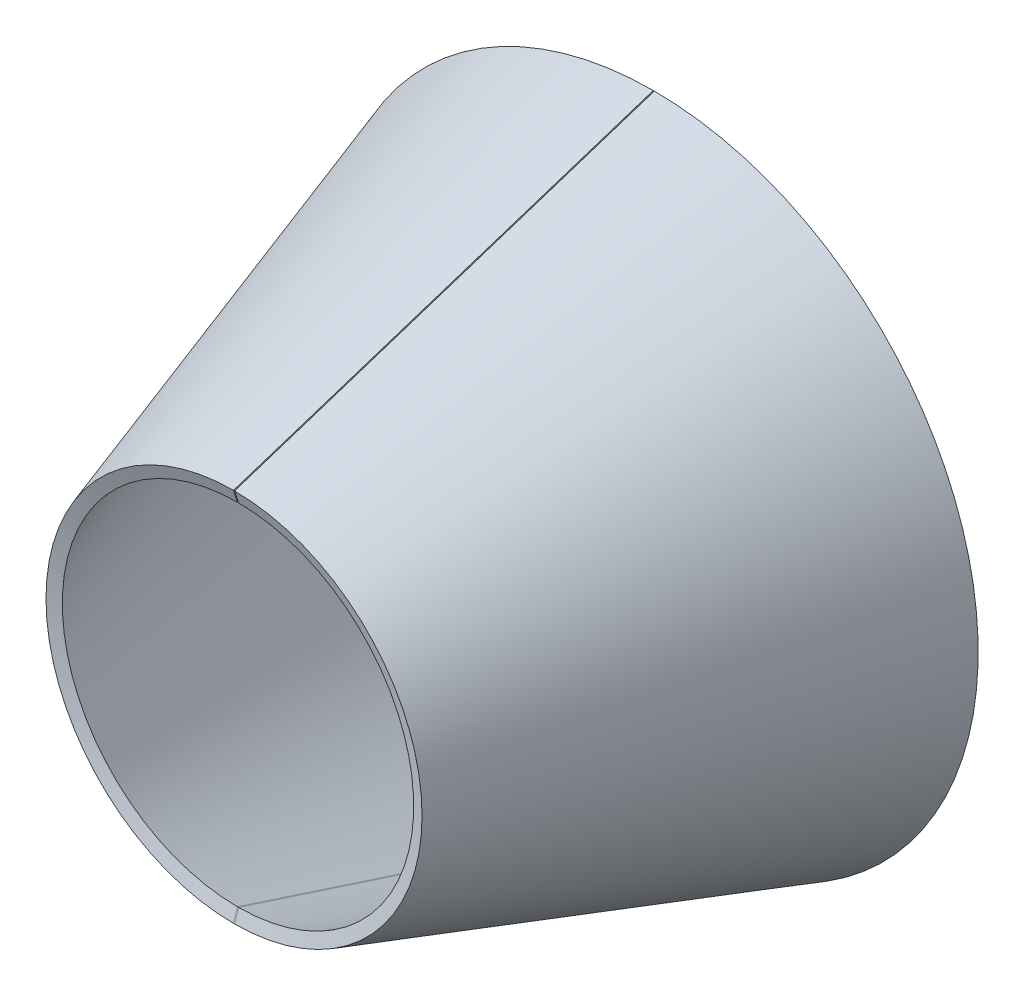
ISO-10303-21;
HEADER;
FILE_DESCRIPTION(('STEP AP214'),'2;1');
FILE_NAME('part.step','',(''),(''),'','','');
FILE_SCHEMA(('AUTOMOTIVE_DESIGN { 1 0 10303 214 1 1 1 1 }'));
ENDSEC;
DATA;
#1=APPLICATION_CONTEXT('core data for automotive mechanical design processes');
#2=APPLICATION_PROTOCOL_DEFINITION('international standard','automotive_design',2000,#1);
#3=PRODUCT_CONTEXT('',#1,'mechanical');
#4=PRODUCT('Part','Part','',(#3));
#5=PRODUCT_RELATED_PRODUCT_CATEGORY('part','',(#4));
#6=PRODUCT_DEFINITION_FORMATION('','',#4);
#7=PRODUCT_DEFINITION_CONTEXT('part definition',#1,'design');
#8=PRODUCT_DEFINITION('design','',#6,#7);
#9=PRODUCT_DEFINITION_SHAPE('','',#8);
#10=(LENGTH_UNIT() NAMED_UNIT(*) SI_UNIT(.MILLI.,.METRE.));
#11=(NAMED_UNIT(*) PLANE_ANGLE_UNIT() SI_UNIT($,.RADIAN.));
#12=(NAMED_UNIT(*) SI_UNIT($,.STERADIAN.) SOLID_ANGLE_UNIT());
#13=UNCERTAINTY_MEASURE_WITH_UNIT(LENGTH_MEASURE(1.E-05),#10,'distance_accuracy_value','');
#14=(GEOMETRIC_REPRESENTATION_CONTEXT(3) GLOBAL_UNCERTAINTY_ASSIGNED_CONTEXT((#13)) GLOBAL_UNIT_ASSIGNED_CONTEXT((#10,
#11,#12)) REPRESENTATION_CONTEXT('',''));
#15=CARTESIAN_POINT('',(0.,0.,0.));
#16=DIRECTION('',(0.,0.,1.));
#17=DIRECTION('',(1.,0.,0.));
#18=AXIS2_PLACEMENT_3D('',#15,#16,#17);
#19=CARTESIAN_POINT('',(0.254,-91.7224397929244,207.295359782405));
#20=DIRECTION('',(0.,0.951056516295156,-0.309016994374941));
#21=DIRECTION('',(0.,0.309016994374941,0.951056516295156));
#22=AXIS2_PLACEMENT_3D('',#19,#20,#21);
#23=PLANE('',#22);
#24=DIRECTION('',(0.,-0.309016994374941,-0.951056516295156));
#25=VECTOR('',#24,1.);
#26=CARTESIAN_POINT('',(-0.254,-91.7224397929244,207.295359782405));
#27=LINE('',#26,#25);
#28=CARTESIAN_POINT('',(-0.253999999999983,-91.7224397929245,207.295359782405));
#29=VERTEX_POINT('',#28);
#30=CARTESIAN_POINT('',(-0.254,-158.439208878474,1.96225791428088));
#31=VERTEX_POINT('',#30);
#32=EDGE_CURVE('E160',#29,#31,#27,.T.);
#33=ORIENTED_EDGE('',*,*,#32,.T.);
#34=DIRECTION('',(-1.,0.,0.));
#35=VECTOR('',#34,1.);
#36=CARTESIAN_POINT('',(0.254,-158.439208878474,1.96225791428076));
#37=LINE('',#36,#35);
#38=CARTESIAN_POINT('',(0.253999999999971,-158.439208878474,1.96225791428084));
#39=VERTEX_POINT('',#38);
#40=EDGE_CURVE('E163',#39,#31,#37,.T.);
#41=ORIENTED_EDGE('',*,*,#40,.F.);
#42=DIRECTION('',(0.,-0.309016994374941,-0.951056516295156));
#43=VECTOR('',#42,1.);
#44=CARTESIAN_POINT('',(0.254,-91.7224397929244,207.295359782405));
#45=LINE('',#44,#43);
#46=CARTESIAN_POINT('',(0.254,-91.7224397929244,207.295359782405));
#47=VERTEX_POINT('',#46);
#48=EDGE_CURVE('E62',#47,#39,#45,.T.);
#49=ORIENTED_EDGE('',*,*,#48,.F.);
#50=DIRECTION('',(-1.,0.,0.));
#51=VECTOR('',#50,1.);
#52=CARTESIAN_POINT('',(0.254,-91.7224397929244,207.295359782405));
#53=LINE('',#52,#51);
#54=EDGE_CURVE('E166',#47,#29,#53,.T.);
#55=ORIENTED_EDGE('',*,*,#54,.T.);
#56=EDGE_LOOP('',(#33,#41,#49,#55));
#57=FACE_BOUND('',#56,.T.);
#58=ADVANCED_FACE('F38',(#57),#23,.F.);
#59=CARTESIAN_POINT('',(0.254,324.984109612484,71.89919433134));
#60=DIRECTION('',(0.,0.309016994374941,0.951056516295156));
#61=DIRECTION('',(0.,-0.951056516295156,0.309016994374941));
#62=AXIS2_PLACEMENT_3D('',#59,#60,#61);
#63=PLANE('',#62);
#64=ORIENTED_EDGE('',*,*,#54,.F.);
#65=DIRECTION('',(0.,-0.951056516295156,0.309016994374941));
#66=VECTOR('',#65,1.);
#67=CARTESIAN_POINT('',(0.254,324.984109612484,71.89919433134));
#68=LINE('',#67,#66);
#69=CARTESIAN_POINT('',(0.254,-85.6832309144502,205.333101868124));
#70=VERTEX_POINT('',#69);
#71=EDGE_CURVE('E46',#70,#47,#68,.T.);
#72=ORIENTED_EDGE('',*,*,#71,.F.);
#73=DIRECTION('',(-1.,0.,0.));
#74=VECTOR('',#73,1.);
#75=CARTESIAN_POINT('',(0.254,-85.6832309144502,205.333101868124));
#76=LINE('',#75,#74);
#77=CARTESIAN_POINT('',(-0.253999999999984,-85.68323091445,205.333101868124));
#78=VERTEX_POINT('',#77);
#79=EDGE_CURVE('E171',#70,#78,#76,.T.);
#80=ORIENTED_EDGE('',*,*,#79,.T.);
#81=DIRECTION('',(0.,-0.951056516295156,0.309016994374941));
#82=VECTOR('',#81,1.);
#83=CARTESIAN_POINT('',(-0.254,324.984109612484,71.89919433134));
#84=LINE('',#83,#82);
#85=EDGE_CURVE('E11',#78,#29,#84,.T.);
#86=ORIENTED_EDGE('',*,*,#85,.T.);
#87=EDGE_LOOP('',(#64,#72,#80,#86));
#88=FACE_BOUND('',#87,.T.);
#89=ADVANCED_FACE('F40',(#88),#63,.T.);
#90=CARTESIAN_POINT('',(0.254,258.267340526934,-133.433907536784));
#91=DIRECTION('',(0.,0.309016994374941,0.951056516295156));
#92=DIRECTION('',(0.,-0.951056516295156,0.309016994374941));
#93=AXIS2_PLACEMENT_3D('',#90,#91,#92);
#94=PLANE('',#93);
#95=DIRECTION('',(0.,-0.951056516295156,0.309016994374941));
#96=VECTOR('',#95,1.);
#97=CARTESIAN_POINT('',(0.254,258.267340526934,-133.433907536784));
#98=LINE('',#97,#96);
#99=CARTESIAN_POINT('',(0.254,-152.4,0.));
#100=VERTEX_POINT('',#99);
#101=EDGE_CURVE('E178',#100,#39,#98,.T.);
#102=ORIENTED_EDGE('',*,*,#101,.T.);
#103=ORIENTED_EDGE('',*,*,#40,.T.);
#104=DIRECTION('',(0.,-0.951056516295156,0.309016994374941));
#105=VECTOR('',#104,1.);
#106=CARTESIAN_POINT('',(-0.254,258.267340526934,-133.433907536784));
#107=LINE('',#106,#105);
#108=CARTESIAN_POINT('',(-0.254000000000028,-152.4,0.));
#109=VERTEX_POINT('',#108);
#110=EDGE_CURVE('E126',#109,#31,#107,.T.);
#111=ORIENTED_EDGE('',*,*,#110,.F.);
#112=DIRECTION('',(-1.,0.,0.));
#113=VECTOR('',#112,1.);
#114=CARTESIAN_POINT('',(0.254,-152.4,0.));
#115=LINE('',#114,#113);
#116=EDGE_CURVE('E53',#100,#109,#115,.T.);
#117=ORIENTED_EDGE('',*,*,#116,.F.);
#118=EDGE_LOOP('',(#102,#103,#111,#117));
#119=FACE_BOUND('',#118,.T.);
#120=ADVANCED_FACE('F203',(#119),#94,.F.);
#121=CARTESIAN_POINT('',(0.254,-85.6832309144502,205.333101868124));
#122=DIRECTION('',(0.,0.951056516295156,-0.309016994374941));
#123=DIRECTION('',(0.,0.309016994374941,0.951056516295156));
#124=AXIS2_PLACEMENT_3D('',#121,#122,#123);
#125=PLANE('',#124);
#126=DIRECTION('',(0.,-0.309016994374941,-0.951056516295156));
#127=VECTOR('',#126,1.);
#128=CARTESIAN_POINT('',(-0.254,-85.6832309144502,205.333101868124));
#129=LINE('',#128,#127);
#130=EDGE_CURVE('E168',#78,#109,#129,.T.);
#131=ORIENTED_EDGE('',*,*,#130,.F.);
#132=ORIENTED_EDGE('',*,*,#79,.F.);
#133=DIRECTION('',(0.,-0.309016994374941,-0.951056516295156));
#134=VECTOR('',#133,1.);
#135=CARTESIAN_POINT('',(0.254,-85.6832309144502,205.333101868124));
#136=LINE('',#135,#134);
#137=EDGE_CURVE('E174',#70,#100,#136,.T.);
#138=ORIENTED_EDGE('',*,*,#137,.T.);
#139=ORIENTED_EDGE('',*,*,#116,.T.);
#140=EDGE_LOOP('',(#131,#132,#138,#139));
#141=FACE_BOUND('',#140,.T.);
#142=ADVANCED_FACE('F200',(#141),#125,.T.);
#143=CARTESIAN_POINT('',(0.253999999996857,155.419604439237,0.981128957140143));
#144=DIRECTION('',(-1.,0.,0.));
#145=DIRECTION('',(0.,-0.309016994374942,0.951056516295156));
#146=AXIS2_PLACEMENT_3D('',#143,#144,#145);
#147=PLANE('',#146);
#148=DIRECTION('',(0.,-0.951056516295156,-0.309016994374941));
#149=VECTOR('',#148,1.);
#150=CARTESIAN_POINT('',(0.253999999998202,88.7028353536873,206.314230825265));
#151=LINE('',#150,#149);
#152=CARTESIAN_POINT('',(0.253999999998141,91.7224397929245,207.295359782405));
#153=VERTEX_POINT('',#152);
#154=CARTESIAN_POINT('',(0.253999999998263,85.68323091445,205.333101868124));
#155=VERTEX_POINT('',#154);
#156=EDGE_CURVE('E158',#153,#155,#151,.T.);
#157=ORIENTED_EDGE('',*,*,#156,.F.);
#158=DIRECTION('',(0.,0.309016994374941,-0.951056516295156));
#159=VECTOR('',#158,1.);
#160=CARTESIAN_POINT('',(0.253999999978811,1045.46756241535,-2728.03030277388));
#161=LINE('',#160,#159);
#162=CARTESIAN_POINT('',(0.253999999996796,158.439208878474,1.96225791428056));
#163=VERTEX_POINT('',#162);
#164=EDGE_CURVE('E152',#163,#153,#161,.F.);
#165=ORIENTED_EDGE('',*,*,#164,.F.);
#166=DIRECTION('',(0.,-0.951056516295155,-0.309016994374941));
#167=VECTOR('',#166,1.);
#168=CARTESIAN_POINT('',(0.253999999996857,155.419604439237,0.981128957140143));
#169=LINE('',#168,#167);
#170=CARTESIAN_POINT('',(0.253999999996918,152.4,-3.76434994286967E-13));
#171=VERTEX_POINT('',#170);
#172=EDGE_CURVE('E142',#163,#171,#169,.T.);
#173=ORIENTED_EDGE('',*,*,#172,.T.);
#174=DIRECTION('',(0.,0.309016994374941,-0.951056516295156));
#175=VECTOR('',#174,1.);
#176=CARTESIAN_POINT('',(0.253999999978934,1039.42835353687,-2729.99256068816));
#177=LINE('',#176,#175);
#178=EDGE_CURVE('E143',#171,#155,#177,.F.);
#179=ORIENTED_EDGE('',*,*,#178,.T.);
#180=EDGE_LOOP('',(#157,#165,#173,#179));
#181=FACE_BOUND('',#180,.T.);
#182=ADVANCED_FACE('F192',(#181),#147,.T.);
#183=CARTESIAN_POINT('',(0.254,0.,0.98112895714042));
#184=DIRECTION('',(0.,0.,1.));
#185=DIRECTION('',(1.,0.,0.));
#186=AXIS2_PLACEMENT_3D('',#183,#184,#185);
#187=CONICAL_SURFACE('',#186,155.419604439237,1.25663706143592);
#188=ORIENTED_EDGE('',*,*,#172,.F.);
#189=CARTESIAN_POINT('',(0.254,0.,1.96225791428084));
#190=DIRECTION('',(0.,0.,-1.));
#191=DIRECTION('',(-1.,0.,0.));
#192=AXIS2_PLACEMENT_3D('',#189,#190,#191);
#193=CIRCLE('',#192,158.439208878474);
#194=EDGE_CURVE('E149',#39,#163,#193,.F.);
#195=ORIENTED_EDGE('',*,*,#194,.F.);
#196=ORIENTED_EDGE('',*,*,#101,.F.);
#197=CARTESIAN_POINT('',(0.254,0.,0.));
#198=DIRECTION('',(0.,0.,-1.));
#199=DIRECTION('',(-1.,0.,0.));
#200=AXIS2_PLACEMENT_3D('',#197,#198,#199);
#201=CIRCLE('',#200,152.4);
#202=EDGE_CURVE('E139',#100,#171,#201,.F.);
#203=ORIENTED_EDGE('',*,*,#202,.T.);
#204=EDGE_LOOP('',(#188,#195,#196,#203));
#205=FACE_BOUND('',#204,.T.);
#206=ADVANCED_FACE('F202',(#205),#187,.T.);
#207=CARTESIAN_POINT('',(0.254,0.,206.314230825265));
#208=DIRECTION('',(0.,0.,1.));
#209=DIRECTION('',(1.,0.,0.));
#210=AXIS2_PLACEMENT_3D('',#207,#208,#209);
#211=CONICAL_SURFACE('',#210,88.7028353536873,1.25663706143592);
#212=CARTESIAN_POINT('',(0.254,0.,207.295359782405));
#213=DIRECTION('',(0.,0.,-1.));
#214=DIRECTION('',(-1.,0.,0.));
#215=AXIS2_PLACEMENT_3D('',#212,#213,#214);
#216=CIRCLE('',#215,91.7224397929244);
#217=EDGE_CURVE('E138',#153,#47,#216,.T.);
#218=ORIENTED_EDGE('',*,*,#217,.F.);
#219=ORIENTED_EDGE('',*,*,#156,.T.);
#220=CARTESIAN_POINT('',(0.254,0.,205.333101868124));
#221=DIRECTION('',(0.,0.,-1.));
#222=DIRECTION('',(-1.,0.,0.));
#223=AXIS2_PLACEMENT_3D('',#220,#221,#222);
#224=CIRCLE('',#223,85.68323091445);
#225=EDGE_CURVE('E146',#155,#70,#224,.T.);
#226=ORIENTED_EDGE('',*,*,#225,.T.);
#227=ORIENTED_EDGE('',*,*,#71,.T.);
#228=EDGE_LOOP('',(#218,#219,#226,#227));
#229=FACE_BOUND('',#228,.T.);
#230=ADVANCED_FACE('F182',(#229),#211,.F.);
#231=CARTESIAN_POINT('',(0.254,0.,-2729.99256068816));
#232=DIRECTION('',(0.,0.,-1.));
#233=DIRECTION('',(-1.,0.,0.));
#234=AXIS2_PLACEMENT_3D('',#231,#232,#233);
#235=CONICAL_SURFACE('',#234,1039.42835353687,0.314159265358973);
#236=ORIENTED_EDGE('',*,*,#137,.F.);
#237=ORIENTED_EDGE('',*,*,#225,.F.);
#238=ORIENTED_EDGE('',*,*,#178,.F.);
#239=ORIENTED_EDGE('',*,*,#202,.F.);
#240=EDGE_LOOP('',(#236,#237,#238,#239));
#241=FACE_BOUND('',#240,.T.);
#242=ADVANCED_FACE('F195',(#241),#235,.F.);
#243=CARTESIAN_POINT('',(0.254,0.,-2728.03030277388));
#244=DIRECTION('',(0.,0.,-1.));
#245=DIRECTION('',(-1.,0.,0.));
#246=AXIS2_PLACEMENT_3D('',#243,#244,#245);
#247=CONICAL_SURFACE('',#246,1045.46756241535,0.314159265358973);
#248=ORIENTED_EDGE('',*,*,#48,.T.);
#249=ORIENTED_EDGE('',*,*,#194,.T.);
#250=ORIENTED_EDGE('',*,*,#164,.T.);
#251=ORIENTED_EDGE('',*,*,#217,.T.);
#252=EDGE_LOOP('',(#248,#249,#250,#251));
#253=FACE_BOUND('',#252,.T.);
#254=ADVANCED_FACE('F188',(#253),#247,.T.);
#255=CARTESIAN_POINT('',(-0.253999999997821,88.7028353536871,206.314230825264));
#256=DIRECTION('',(1.,0.,0.));
#257=DIRECTION('',(0.,0.309016994374941,-0.951056516295156));
#258=AXIS2_PLACEMENT_3D('',#255,#256,#257);
#259=PLANE('',#258);
#260=DIRECTION('',(0.,0.951056516295156,0.309016994374941));
#261=VECTOR('',#260,1.);
#262=CARTESIAN_POINT('',(-0.253999999997821,88.7028353536871,206.314230825264));
#263=LINE('',#262,#261);
#264=CARTESIAN_POINT('',(-0.253999999997895,85.6832309144501,205.333101868124));
#265=VERTEX_POINT('',#264);
#266=CARTESIAN_POINT('',(-0.253999999997747,91.7224397929245,207.295359782405));
#267=VERTEX_POINT('',#266);
#268=EDGE_CURVE('E115',#265,#267,#263,.T.);
#269=ORIENTED_EDGE('',*,*,#268,.F.);
#270=DIRECTION('',(0.,0.309016994374941,-0.951056516295156));
#271=VECTOR('',#270,1.);
#272=CARTESIAN_POINT('',(-0.25399999997606,1039.42835353687,-2729.99256068816));
#273=LINE('',#272,#271);
#274=CARTESIAN_POINT('',(-0.253999999996607,152.4,0.));
#275=VERTEX_POINT('',#274);
#276=EDGE_CURVE('E111',#265,#275,#273,.T.);
#277=ORIENTED_EDGE('',*,*,#276,.T.);
#278=DIRECTION('',(0.,0.951056516295156,0.309016994374941));
#279=VECTOR('',#278,1.);
#280=CARTESIAN_POINT('',(-0.253999999996539,155.419604439237,0.98112895714042));
#281=LINE('',#280,#279);
#282=CARTESIAN_POINT('',(-0.253999999996472,158.439208878474,1.9622579142809));
#283=VERTEX_POINT('',#282);
#284=EDGE_CURVE('E106',#275,#283,#281,.T.);
#285=ORIENTED_EDGE('',*,*,#284,.T.);
#286=DIRECTION('',(0.,0.309016994374941,-0.951056516295156));
#287=VECTOR('',#286,1.);
#288=CARTESIAN_POINT('',(-0.253999999975921,1045.46756241535,-2728.03030277388));
#289=LINE('',#288,#287);
#290=EDGE_CURVE('E109',#267,#283,#289,.T.);
#291=ORIENTED_EDGE('',*,*,#290,.F.);
#292=EDGE_LOOP('',(#269,#277,#285,#291));
#293=FACE_BOUND('',#292,.T.);
#294=ADVANCED_FACE('F108',(#293),#259,.T.);
#295=CARTESIAN_POINT('',(-0.254,0.,0.98112895714042));
#296=DIRECTION('',(0.,0.,1.));
#297=DIRECTION('',(1.,0.,0.));
#298=AXIS2_PLACEMENT_3D('',#295,#296,#297);
#299=CONICAL_SURFACE('',#298,155.419604439237,1.25663706143592);
#300=ORIENTED_EDGE('',*,*,#284,.F.);
#301=CARTESIAN_POINT('',(-0.254,0.,0.));
#302=DIRECTION('',(0.,0.,-1.));
#303=DIRECTION('',(-1.,0.,0.));
#304=AXIS2_PLACEMENT_3D('',#301,#302,#303);
#305=CIRCLE('',#304,152.4);
#306=EDGE_CURVE('E134',#275,#109,#305,.F.);
#307=ORIENTED_EDGE('',*,*,#306,.T.);
#308=ORIENTED_EDGE('',*,*,#110,.T.);
#309=CARTESIAN_POINT('',(-0.254,0.,1.96225791428084));
#310=DIRECTION('',(0.,0.,-1.));
#311=DIRECTION('',(-1.,0.,0.));
#312=AXIS2_PLACEMENT_3D('',#309,#310,#311);
#313=CIRCLE('',#312,158.439208878474);
#314=EDGE_CURVE('E122',#283,#31,#313,.F.);
#315=ORIENTED_EDGE('',*,*,#314,.F.);
#316=EDGE_LOOP('',(#300,#307,#308,#315));
#317=FACE_BOUND('',#316,.T.);
#318=ADVANCED_FACE('F125',(#317),#299,.T.);
#319=CARTESIAN_POINT('',(-0.254,0.,206.314230825265));
#320=DIRECTION('',(0.,0.,1.));
#321=DIRECTION('',(1.,0.,0.));
#322=AXIS2_PLACEMENT_3D('',#319,#320,#321);
#323=CONICAL_SURFACE('',#322,88.7028353536872,1.25663706143592);
#324=CARTESIAN_POINT('',(-0.254,0.,205.333101868124));
#325=DIRECTION('',(0.,0.,-1.));
#326=DIRECTION('',(-1.,0.,0.));
#327=AXIS2_PLACEMENT_3D('',#324,#325,#326);
#328=CIRCLE('',#327,85.68323091445);
#329=EDGE_CURVE('E128',#78,#265,#328,.T.);
#330=ORIENTED_EDGE('',*,*,#329,.T.);
#331=ORIENTED_EDGE('',*,*,#268,.T.);
#332=CARTESIAN_POINT('',(-0.254,0.,207.295359782405));
#333=DIRECTION('',(0.,0.,-1.));
#334=DIRECTION('',(-1.,0.,0.));
#335=AXIS2_PLACEMENT_3D('',#332,#333,#334);
#336=CIRCLE('',#335,91.7224397929244);
#337=EDGE_CURVE('E116',#29,#267,#336,.T.);
#338=ORIENTED_EDGE('',*,*,#337,.F.);
#339=ORIENTED_EDGE('',*,*,#85,.F.);
#340=EDGE_LOOP('',(#330,#331,#338,#339));
#341=FACE_BOUND('',#340,.T.);
#342=ADVANCED_FACE('F206',(#341),#323,.F.);
#343=CARTESIAN_POINT('',(-0.254,0.,-2728.03030277388));
#344=DIRECTION('',(0.,0.,-1.));
#345=DIRECTION('',(-1.,0.,0.));
#346=AXIS2_PLACEMENT_3D('',#343,#344,#345);
#347=CONICAL_SURFACE('',#346,1045.46756241535,0.314159265358973);
#348=ORIENTED_EDGE('',*,*,#32,.F.);
#349=ORIENTED_EDGE('',*,*,#337,.T.);
#350=ORIENTED_EDGE('',*,*,#290,.T.);
#351=ORIENTED_EDGE('',*,*,#314,.T.);
#352=EDGE_LOOP('',(#348,#349,#350,#351));
#353=FACE_BOUND('',#352,.T.);
#354=ADVANCED_FACE('F121',(#353),#347,.T.);
#355=CARTESIAN_POINT('',(-0.254,0.,-2729.99256068816));
#356=DIRECTION('',(0.,0.,-1.));
#357=DIRECTION('',(-1.,0.,0.));
#358=AXIS2_PLACEMENT_3D('',#355,#356,#357);
#359=CONICAL_SURFACE('',#358,1039.42835353687,0.314159265358973);
#360=ORIENTED_EDGE('',*,*,#130,.T.);
#361=ORIENTED_EDGE('',*,*,#306,.F.);
#362=ORIENTED_EDGE('',*,*,#276,.F.);
#363=ORIENTED_EDGE('',*,*,#329,.F.);
#364=EDGE_LOOP('',(#360,#361,#362,#363));
#365=FACE_BOUND('',#364,.T.);
#366=ADVANCED_FACE('F208',(#365),#359,.F.);
#367=CLOSED_SHELL('',(#58,#89,#120,#142,#182,#206,#230,#242,#254,#294,#318,#342,#354,#366));
#368=MANIFOLD_SOLID_BREP('B2',#367);
#369=ADVANCED_BREP_SHAPE_REPRESENTATION('',(#18,#368),#14);
#370=SHAPE_DEFINITION_REPRESENTATION(#9,#369);
ENDSEC;
END-ISO-10303-21;
